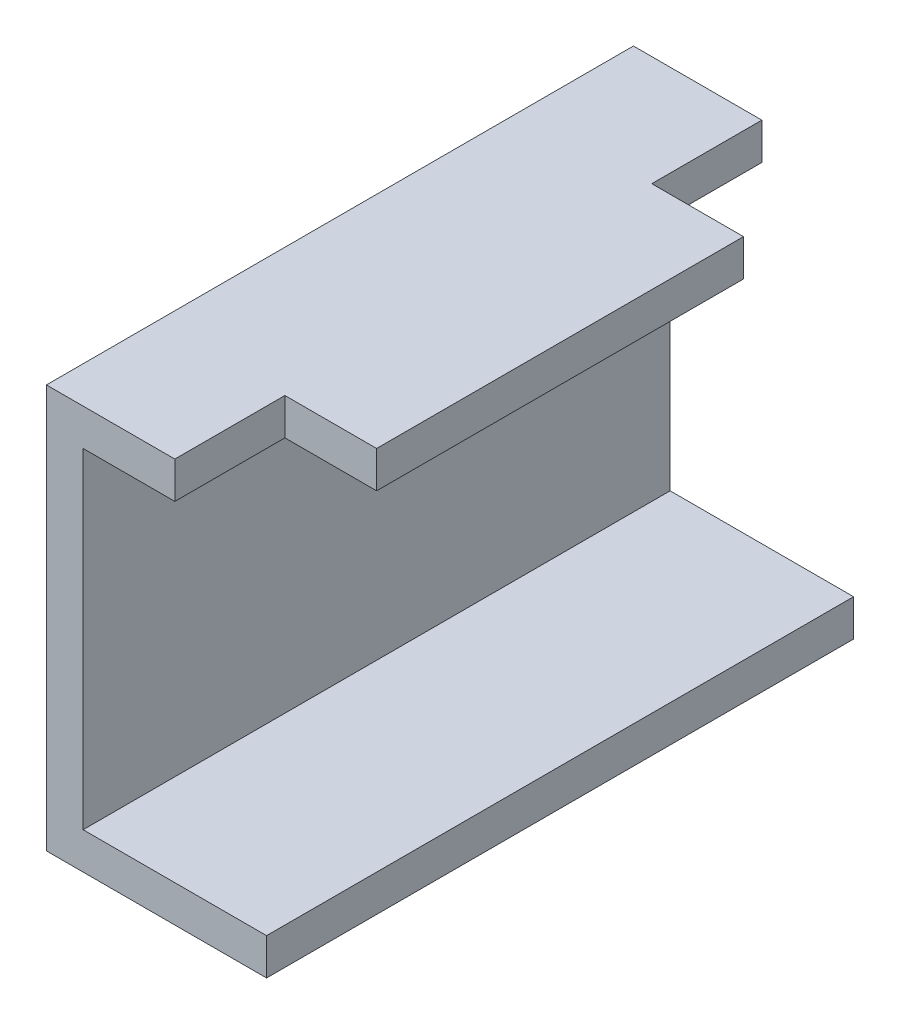
ISO-10303-21;
HEADER;
FILE_DESCRIPTION(('STEP AP214'),'2;1');
FILE_NAME('part.step','',(''),(''),'','','');
FILE_SCHEMA(('AUTOMOTIVE_DESIGN { 1 0 10303 214 1 1 1 1 }'));
ENDSEC;
DATA;
#1=APPLICATION_CONTEXT('core data for automotive mechanical design processes');
#2=APPLICATION_PROTOCOL_DEFINITION('international standard','automotive_design',2000,#1);
#3=PRODUCT_CONTEXT('',#1,'mechanical');
#4=PRODUCT('Part','Part','',(#3));
#5=PRODUCT_RELATED_PRODUCT_CATEGORY('part','',(#4));
#6=PRODUCT_DEFINITION_FORMATION('','',#4);
#7=PRODUCT_DEFINITION_CONTEXT('part definition',#1,'design');
#8=PRODUCT_DEFINITION('design','',#6,#7);
#9=PRODUCT_DEFINITION_SHAPE('','',#8);
#10=(LENGTH_UNIT() NAMED_UNIT(*) SI_UNIT(.MILLI.,.METRE.));
#11=(NAMED_UNIT(*) PLANE_ANGLE_UNIT() SI_UNIT($,.RADIAN.));
#12=(NAMED_UNIT(*) SI_UNIT($,.STERADIAN.) SOLID_ANGLE_UNIT());
#13=UNCERTAINTY_MEASURE_WITH_UNIT(LENGTH_MEASURE(1.E-05),#10,'distance_accuracy_value','');
#14=(GEOMETRIC_REPRESENTATION_CONTEXT(3) GLOBAL_UNCERTAINTY_ASSIGNED_CONTEXT((#13)) GLOBAL_UNIT_ASSIGNED_CONTEXT((#10,
#11,#12)) REPRESENTATION_CONTEXT('',''));
#15=CARTESIAN_POINT('',(0.,0.,0.));
#16=DIRECTION('',(0.,0.,1.));
#17=DIRECTION('',(1.,0.,0.));
#18=AXIS2_PLACEMENT_3D('',#15,#16,#17);
#19=CARTESIAN_POINT('',(-6.7309,3.0256,5.823));
#20=DIRECTION('',(0.,-1.,0.));
#21=DIRECTION('',(0.,0.,-1.));
#22=AXIS2_PLACEMENT_3D('',#19,#20,#21);
#23=PLANE('',#22);
#24=DIRECTION('',(0.,0.,1.));
#25=VECTOR('',#24,1.);
#26=CARTESIAN_POINT('',(-6.4809,3.0256,5.823));
#27=LINE('',#26,#25);
#28=CARTESIAN_POINT('',(-6.4809,3.0256,5.823));
#29=VERTEX_POINT('',#28);
#30=CARTESIAN_POINT('',(-6.4809,3.0256,6.623));
#31=VERTEX_POINT('',#30);
#32=EDGE_CURVE('E11',#29,#31,#27,.T.);
#33=ORIENTED_EDGE('',*,*,#32,.F.);
#34=DIRECTION('',(1.,0.,0.));
#35=VECTOR('',#34,1.);
#36=CARTESIAN_POINT('',(-6.7309,3.0256,5.823));
#37=LINE('',#36,#35);
#38=CARTESIAN_POINT('',(-6.7309,3.0256,5.823));
#39=VERTEX_POINT('',#38);
#40=EDGE_CURVE('E24',#39,#29,#37,.T.);
#41=ORIENTED_EDGE('',*,*,#40,.F.);
#42=DIRECTION('',(0.,0.,-1.));
#43=VECTOR('',#42,1.);
#44=CARTESIAN_POINT('',(-6.7309,3.0256,5.823));
#45=LINE('',#44,#43);
#46=CARTESIAN_POINT('',(-6.7309,3.0256,6.623));
#47=VERTEX_POINT('',#46);
#48=EDGE_CURVE('E203',#47,#39,#45,.T.);
#49=ORIENTED_EDGE('',*,*,#48,.F.);
#50=DIRECTION('',(1.,0.,0.));
#51=VECTOR('',#50,1.);
#52=CARTESIAN_POINT('',(-6.7309,3.0256,6.623));
#53=LINE('',#52,#51);
#54=EDGE_CURVE('E201',#47,#31,#53,.T.);
#55=ORIENTED_EDGE('',*,*,#54,.T.);
#56=EDGE_LOOP('',(#33,#41,#49,#55));
#57=FACE_BOUND('',#56,.T.);
#58=ADVANCED_FACE('F17',(#57),#23,.F.);
#59=CARTESIAN_POINT('',(-6.7809,2.9756,6.623));
#60=DIRECTION('',(0.,1.,0.));
#61=DIRECTION('',(0.,0.,1.));
#62=AXIS2_PLACEMENT_3D('',#59,#60,#61);
#63=PLANE('',#62);
#64=DIRECTION('',(0.,0.,-1.));
#65=VECTOR('',#64,1.);
#66=CARTESIAN_POINT('',(-6.4809,2.9756,6.623));
#67=LINE('',#66,#65);
#68=CARTESIAN_POINT('',(-6.4809,2.9756,6.623));
#69=VERTEX_POINT('',#68);
#70=CARTESIAN_POINT('',(-6.4809,2.9756,5.823));
#71=VERTEX_POINT('',#70);
#72=EDGE_CURVE('E199',#69,#71,#67,.T.);
#73=ORIENTED_EDGE('',*,*,#72,.F.);
#74=DIRECTION('',(1.,0.,0.));
#75=VECTOR('',#74,1.);
#76=CARTESIAN_POINT('',(-6.7809,2.9756,6.623));
#77=LINE('',#76,#75);
#78=CARTESIAN_POINT('',(-6.7809,2.9756,6.623));
#79=VERTEX_POINT('',#78);
#80=EDGE_CURVE('E196',#79,#69,#77,.T.);
#81=ORIENTED_EDGE('',*,*,#80,.F.);
#82=DIRECTION('',(0.,0.,1.));
#83=VECTOR('',#82,1.);
#84=CARTESIAN_POINT('',(-6.7809,2.9756,6.623));
#85=LINE('',#84,#83);
#86=CARTESIAN_POINT('',(-6.7809,2.9756,5.823));
#87=VERTEX_POINT('',#86);
#88=EDGE_CURVE('E193',#87,#79,#85,.T.);
#89=ORIENTED_EDGE('',*,*,#88,.F.);
#90=DIRECTION('',(1.,0.,0.));
#91=VECTOR('',#90,1.);
#92=CARTESIAN_POINT('',(-6.7809,2.9756,5.823));
#93=LINE('',#92,#91);
#94=EDGE_CURVE('E190',#87,#71,#93,.T.);
#95=ORIENTED_EDGE('',*,*,#94,.T.);
#96=EDGE_LOOP('',(#73,#81,#89,#95));
#97=FACE_BOUND('',#96,.T.);
#98=ADVANCED_FACE('F213',(#97),#63,.F.);
#99=CARTESIAN_POINT('',(-6.7309,3.4756,5.823));
#100=DIRECTION('',(1.,0.,0.));
#101=DIRECTION('',(0.,1.,0.));
#102=AXIS2_PLACEMENT_3D('',#99,#100,#101);
#103=PLANE('',#102);
#104=DIRECTION('',(0.,-1.,0.));
#105=VECTOR('',#104,1.);
#106=CARTESIAN_POINT('',(-6.7309,3.4756,6.623));
#107=LINE('',#106,#105);
#108=CARTESIAN_POINT('',(-6.7309,3.4756,6.623));
#109=VERTEX_POINT('',#108);
#110=EDGE_CURVE('E187',#109,#47,#107,.T.);
#111=ORIENTED_EDGE('',*,*,#110,.T.);
#112=ORIENTED_EDGE('',*,*,#48,.T.);
#113=DIRECTION('',(0.,-1.,0.));
#114=VECTOR('',#113,1.);
#115=CARTESIAN_POINT('',(-6.7309,3.4756,5.823));
#116=LINE('',#115,#114);
#117=CARTESIAN_POINT('',(-6.7309,3.4756,5.823));
#118=VERTEX_POINT('',#117);
#119=EDGE_CURVE('E184',#118,#39,#116,.T.);
#120=ORIENTED_EDGE('',*,*,#119,.F.);
#121=DIRECTION('',(0.,0.,1.));
#122=VECTOR('',#121,1.);
#123=CARTESIAN_POINT('',(-6.7309,3.4756,5.823));
#124=LINE('',#123,#122);
#125=EDGE_CURVE('E181',#118,#109,#124,.T.);
#126=ORIENTED_EDGE('',*,*,#125,.T.);
#127=EDGE_LOOP('',(#111,#112,#120,#126));
#128=FACE_BOUND('',#127,.T.);
#129=ADVANCED_FACE('F223',(#128),#103,.T.);
#130=CARTESIAN_POINT('',(-6.7809,3.5256,6.623));
#131=DIRECTION('',(-1.,0.,0.));
#132=DIRECTION('',(0.,-1.,0.));
#133=AXIS2_PLACEMENT_3D('',#130,#131,#132);
#134=PLANE('',#133);
#135=DIRECTION('',(0.,-1.,0.));
#136=VECTOR('',#135,1.);
#137=CARTESIAN_POINT('',(-6.7809,3.5256,5.823));
#138=LINE('',#137,#136);
#139=CARTESIAN_POINT('',(-6.7809,3.5256,5.823));
#140=VERTEX_POINT('',#139);
#141=EDGE_CURVE('E178',#140,#87,#138,.T.);
#142=ORIENTED_EDGE('',*,*,#141,.T.);
#143=ORIENTED_EDGE('',*,*,#88,.T.);
#144=DIRECTION('',(0.,-1.,0.));
#145=VECTOR('',#144,1.);
#146=CARTESIAN_POINT('',(-6.7809,3.5256,6.623));
#147=LINE('',#146,#145);
#148=CARTESIAN_POINT('',(-6.7809,3.5256,6.623));
#149=VERTEX_POINT('',#148);
#150=EDGE_CURVE('E175',#149,#79,#147,.T.);
#151=ORIENTED_EDGE('',*,*,#150,.F.);
#152=DIRECTION('',(0.,0.,-1.));
#153=VECTOR('',#152,1.);
#154=CARTESIAN_POINT('',(-6.7809,3.5256,6.623));
#155=LINE('',#154,#153);
#156=EDGE_CURVE('E172',#149,#140,#155,.T.);
#157=ORIENTED_EDGE('',*,*,#156,.T.);
#158=EDGE_LOOP('',(#142,#143,#151,#157));
#159=FACE_BOUND('',#158,.T.);
#160=ADVANCED_FACE('F215',(#159),#134,.T.);
#161=CARTESIAN_POINT('',(-7.5574609770941,3.4756,5.823));
#162=DIRECTION('',(0.,1.,0.));
#163=DIRECTION('',(-1.,0.,0.));
#164=AXIS2_PLACEMENT_3D('',#161,#162,#163);
#165=PLANE('',#164);
#166=DIRECTION('',(0.,0.,1.));
#167=VECTOR('',#166,1.);
#168=CARTESIAN_POINT('',(-6.4809,3.4756,5.823));
#169=LINE('',#168,#167);
#170=CARTESIAN_POINT('',(-6.4809,3.4756,5.973));
#171=VERTEX_POINT('',#170);
#172=CARTESIAN_POINT('',(-6.4809,3.4756,6.473));
#173=VERTEX_POINT('',#172);
#174=EDGE_CURVE('E170',#171,#173,#169,.T.);
#175=ORIENTED_EDGE('',*,*,#174,.T.);
#176=DIRECTION('',(1.,0.,0.));
#177=VECTOR('',#176,1.);
#178=CARTESIAN_POINT('',(-6.4809,3.4756,6.473));
#179=LINE('',#178,#177);
#180=CARTESIAN_POINT('',(-6.6059,3.4756,6.473));
#181=VERTEX_POINT('',#180);
#182=EDGE_CURVE('E167',#181,#173,#179,.T.);
#183=ORIENTED_EDGE('',*,*,#182,.F.);
#184=DIRECTION('',(0.,0.,-1.));
#185=VECTOR('',#184,1.);
#186=CARTESIAN_POINT('',(-6.6059,3.4756,6.623));
#187=LINE('',#186,#185);
#188=CARTESIAN_POINT('',(-6.6059,3.4756,6.623));
#189=VERTEX_POINT('',#188);
#190=EDGE_CURVE('E164',#189,#181,#187,.T.);
#191=ORIENTED_EDGE('',*,*,#190,.F.);
#192=DIRECTION('',(1.,0.,0.));
#193=VECTOR('',#192,1.);
#194=CARTESIAN_POINT('',(-7.5574609770941,3.4756,6.623));
#195=LINE('',#194,#193);
#196=EDGE_CURVE('E161',#109,#189,#195,.T.);
#197=ORIENTED_EDGE('',*,*,#196,.F.);
#198=ORIENTED_EDGE('',*,*,#125,.F.);
#199=DIRECTION('',(1.,0.,0.));
#200=VECTOR('',#199,1.);
#201=CARTESIAN_POINT('',(-7.5574609770941,3.4756,5.823));
#202=LINE('',#201,#200);
#203=CARTESIAN_POINT('',(-6.6059,3.4756,5.823));
#204=VERTEX_POINT('',#203);
#205=EDGE_CURVE('E159',#118,#204,#202,.T.);
#206=ORIENTED_EDGE('',*,*,#205,.T.);
#207=DIRECTION('',(0.,0.,-1.));
#208=VECTOR('',#207,1.);
#209=CARTESIAN_POINT('',(-6.6059,3.4756,5.823));
#210=LINE('',#209,#208);
#211=CARTESIAN_POINT('',(-6.6059,3.4756,5.973));
#212=VERTEX_POINT('',#211);
#213=EDGE_CURVE('E157',#212,#204,#210,.T.);
#214=ORIENTED_EDGE('',*,*,#213,.F.);
#215=DIRECTION('',(-1.,0.,0.));
#216=VECTOR('',#215,1.);
#217=CARTESIAN_POINT('',(-6.4809,3.4756,5.973));
#218=LINE('',#217,#216);
#219=EDGE_CURVE('E127',#171,#212,#218,.T.);
#220=ORIENTED_EDGE('',*,*,#219,.F.);
#221=EDGE_LOOP('',(#175,#183,#191,#197,#198,#206,#214,#220));
#222=FACE_BOUND('',#221,.T.);
#223=ADVANCED_FACE('F220',(#222),#165,.F.);
#224=CARTESIAN_POINT('',(-7.5574609770941,3.5256,5.823));
#225=DIRECTION('',(0.,0.,1.));
#226=DIRECTION('',(0.,-1.,0.));
#227=AXIS2_PLACEMENT_3D('',#224,#225,#226);
#228=PLANE('',#227);
#229=DIRECTION('',(1.,0.,0.));
#230=VECTOR('',#229,1.);
#231=CARTESIAN_POINT('',(-7.5574609770941,3.5256,5.823));
#232=LINE('',#231,#230);
#233=CARTESIAN_POINT('',(-6.6059,3.5256,5.823));
#234=VERTEX_POINT('',#233);
#235=EDGE_CURVE('E154',#140,#234,#232,.T.);
#236=ORIENTED_EDGE('',*,*,#235,.T.);
#237=DIRECTION('',(0.,1.,0.));
#238=VECTOR('',#237,1.);
#239=CARTESIAN_POINT('',(-6.6059,2.9746,5.823));
#240=LINE('',#239,#238);
#241=EDGE_CURVE('E121',#204,#234,#240,.T.);
#242=ORIENTED_EDGE('',*,*,#241,.F.);
#243=ORIENTED_EDGE('',*,*,#205,.F.);
#244=ORIENTED_EDGE('',*,*,#119,.T.);
#245=ORIENTED_EDGE('',*,*,#40,.T.);
#246=DIRECTION('',(0.,1.,0.));
#247=VECTOR('',#246,1.);
#248=CARTESIAN_POINT('',(-6.4809,3.2506,5.823));
#249=LINE('',#248,#247);
#250=EDGE_CURVE('E151',#71,#29,#249,.T.);
#251=ORIENTED_EDGE('',*,*,#250,.F.);
#252=ORIENTED_EDGE('',*,*,#94,.F.);
#253=ORIENTED_EDGE('',*,*,#141,.F.);
#254=EDGE_LOOP('',(#236,#242,#243,#244,#245,#251,#252,#253));
#255=FACE_BOUND('',#254,.T.);
#256=ADVANCED_FACE('F207',(#255),#228,.F.);
#257=CARTESIAN_POINT('',(-7.5574609770941,3.5256,6.623));
#258=DIRECTION('',(0.,-1.,0.));
#259=DIRECTION('',(1.,0.,0.));
#260=AXIS2_PLACEMENT_3D('',#257,#258,#259);
#261=PLANE('',#260);
#262=DIRECTION('',(0.,0.,1.));
#263=VECTOR('',#262,1.);
#264=CARTESIAN_POINT('',(-6.6059,3.5256,6.623));
#265=LINE('',#264,#263);
#266=CARTESIAN_POINT('',(-6.6059,3.5256,6.473));
#267=VERTEX_POINT('',#266);
#268=CARTESIAN_POINT('',(-6.6059,3.5256,6.623));
#269=VERTEX_POINT('',#268);
#270=EDGE_CURVE('E149',#267,#269,#265,.T.);
#271=ORIENTED_EDGE('',*,*,#270,.F.);
#272=DIRECTION('',(-1.,0.,0.));
#273=VECTOR('',#272,1.);
#274=CARTESIAN_POINT('',(-6.4809,3.5256,6.473));
#275=LINE('',#274,#273);
#276=CARTESIAN_POINT('',(-6.4809,3.5256,6.473));
#277=VERTEX_POINT('',#276);
#278=EDGE_CURVE('E146',#277,#267,#275,.T.);
#279=ORIENTED_EDGE('',*,*,#278,.F.);
#280=DIRECTION('',(0.,0.,-1.));
#281=VECTOR('',#280,1.);
#282=CARTESIAN_POINT('',(-6.4809,3.5256,6.623));
#283=LINE('',#282,#281);
#284=CARTESIAN_POINT('',(-6.4809,3.5256,5.973));
#285=VERTEX_POINT('',#284);
#286=EDGE_CURVE('E108',#277,#285,#283,.T.);
#287=ORIENTED_EDGE('',*,*,#286,.T.);
#288=DIRECTION('',(1.,0.,0.));
#289=VECTOR('',#288,1.);
#290=CARTESIAN_POINT('',(-6.4809,3.5256,5.973));
#291=LINE('',#290,#289);
#292=CARTESIAN_POINT('',(-6.6059,3.5256,5.973));
#293=VERTEX_POINT('',#292);
#294=EDGE_CURVE('E102',#293,#285,#291,.T.);
#295=ORIENTED_EDGE('',*,*,#294,.F.);
#296=DIRECTION('',(0.,0.,1.));
#297=VECTOR('',#296,1.);
#298=CARTESIAN_POINT('',(-6.6059,3.5256,5.823));
#299=LINE('',#298,#297);
#300=EDGE_CURVE('E106',#234,#293,#299,.T.);
#301=ORIENTED_EDGE('',*,*,#300,.F.);
#302=ORIENTED_EDGE('',*,*,#235,.F.);
#303=ORIENTED_EDGE('',*,*,#156,.F.);
#304=DIRECTION('',(1.,0.,0.));
#305=VECTOR('',#304,1.);
#306=CARTESIAN_POINT('',(-7.5574609770941,3.5256,6.623));
#307=LINE('',#306,#305);
#308=EDGE_CURVE('E122',#149,#269,#307,.T.);
#309=ORIENTED_EDGE('',*,*,#308,.T.);
#310=EDGE_LOOP('',(#271,#279,#287,#295,#301,#302,#303,#309));
#311=FACE_BOUND('',#310,.T.);
#312=ADVANCED_FACE('F104',(#311),#261,.F.);
#313=CARTESIAN_POINT('',(-7.5574609770941,3.4756,6.623));
#314=DIRECTION('',(0.,0.,-1.));
#315=DIRECTION('',(-1.,0.,0.));
#316=AXIS2_PLACEMENT_3D('',#313,#314,#315);
#317=PLANE('',#316);
#318=ORIENTED_EDGE('',*,*,#196,.T.);
#319=DIRECTION('',(0.,1.,0.));
#320=VECTOR('',#319,1.);
#321=CARTESIAN_POINT('',(-6.6059,2.9746,6.623));
#322=LINE('',#321,#320);
#323=EDGE_CURVE('E140',#189,#269,#322,.T.);
#324=ORIENTED_EDGE('',*,*,#323,.T.);
#325=ORIENTED_EDGE('',*,*,#308,.F.);
#326=ORIENTED_EDGE('',*,*,#150,.T.);
#327=ORIENTED_EDGE('',*,*,#80,.T.);
#328=DIRECTION('',(0.,-1.,0.));
#329=VECTOR('',#328,1.);
#330=CARTESIAN_POINT('',(-6.4809,3.2506,6.623));
#331=LINE('',#330,#329);
#332=EDGE_CURVE('E138',#31,#69,#331,.T.);
#333=ORIENTED_EDGE('',*,*,#332,.F.);
#334=ORIENTED_EDGE('',*,*,#54,.F.);
#335=ORIENTED_EDGE('',*,*,#110,.F.);
#336=EDGE_LOOP('',(#318,#324,#325,#326,#327,#333,#334,#335));
#337=FACE_BOUND('',#336,.T.);
#338=ADVANCED_FACE('F226',(#337),#317,.F.);
#339=CARTESIAN_POINT('',(-6.4809,3.5256,6.623));
#340=DIRECTION('',(-1.,0.,0.));
#341=DIRECTION('',(0.,0.,1.));
#342=AXIS2_PLACEMENT_3D('',#339,#340,#341);
#343=PLANE('',#342);
#344=ORIENTED_EDGE('',*,*,#286,.F.);
#345=DIRECTION('',(0.,1.,0.));
#346=VECTOR('',#345,1.);
#347=CARTESIAN_POINT('',(-6.4809,2.9746,6.473));
#348=LINE('',#347,#346);
#349=EDGE_CURVE('E131',#173,#277,#348,.T.);
#350=ORIENTED_EDGE('',*,*,#349,.F.);
#351=ORIENTED_EDGE('',*,*,#174,.F.);
#352=DIRECTION('',(0.,1.,0.));
#353=VECTOR('',#352,1.);
#354=CARTESIAN_POINT('',(-6.4809,2.9746,5.973));
#355=LINE('',#354,#353);
#356=EDGE_CURVE('E128',#171,#285,#355,.T.);
#357=ORIENTED_EDGE('',*,*,#356,.T.);
#358=EDGE_LOOP('',(#344,#350,#351,#357));
#359=FACE_BOUND('',#358,.T.);
#360=ADVANCED_FACE('F235',(#359),#343,.F.);
#361=CARTESIAN_POINT('',(-6.4809,3.0006,6.223));
#362=DIRECTION('',(1.,0.,0.));
#363=DIRECTION('',(0.,0.,-1.));
#364=AXIS2_PLACEMENT_3D('',#361,#362,#363);
#365=PLANE('',#364);
#366=ORIENTED_EDGE('',*,*,#332,.T.);
#367=ORIENTED_EDGE('',*,*,#72,.T.);
#368=ORIENTED_EDGE('',*,*,#250,.T.);
#369=ORIENTED_EDGE('',*,*,#32,.T.);
#370=EDGE_LOOP('',(#366,#367,#368,#369));
#371=FACE_BOUND('',#370,.T.);
#372=ADVANCED_FACE('F210',(#371),#365,.T.);
#373=CARTESIAN_POINT('',(-6.6059,2.9746,5.823));
#374=DIRECTION('',(-1.,0.,0.));
#375=DIRECTION('',(0.,-1.,0.));
#376=AXIS2_PLACEMENT_3D('',#373,#374,#375);
#377=PLANE('',#376);
#378=ORIENTED_EDGE('',*,*,#213,.T.);
#379=ORIENTED_EDGE('',*,*,#241,.T.);
#380=ORIENTED_EDGE('',*,*,#300,.T.);
#381=DIRECTION('',(0.,1.,0.));
#382=VECTOR('',#381,1.);
#383=CARTESIAN_POINT('',(-6.6059,2.9746,5.973));
#384=LINE('',#383,#382);
#385=EDGE_CURVE('E119',#212,#293,#384,.T.);
#386=ORIENTED_EDGE('',*,*,#385,.F.);
#387=EDGE_LOOP('',(#378,#379,#380,#386));
#388=FACE_BOUND('',#387,.T.);
#389=ADVANCED_FACE('F118',(#388),#377,.F.);
#390=CARTESIAN_POINT('',(-6.4809,2.9746,5.973));
#391=DIRECTION('',(0.,0.,1.));
#392=DIRECTION('',(0.,-1.,0.));
#393=AXIS2_PLACEMENT_3D('',#390,#391,#392);
#394=PLANE('',#393);
#395=ORIENTED_EDGE('',*,*,#219,.T.);
#396=ORIENTED_EDGE('',*,*,#385,.T.);
#397=ORIENTED_EDGE('',*,*,#294,.T.);
#398=ORIENTED_EDGE('',*,*,#356,.F.);
#399=EDGE_LOOP('',(#395,#396,#397,#398));
#400=FACE_BOUND('',#399,.T.);
#401=ADVANCED_FACE('F125',(#400),#394,.F.);
#402=CARTESIAN_POINT('',(-6.4809,2.9746,6.473));
#403=DIRECTION('',(0.,0.,-1.));
#404=DIRECTION('',(0.,1.,0.));
#405=AXIS2_PLACEMENT_3D('',#402,#403,#404);
#406=PLANE('',#405);
#407=ORIENTED_EDGE('',*,*,#182,.T.);
#408=ORIENTED_EDGE('',*,*,#349,.T.);
#409=ORIENTED_EDGE('',*,*,#278,.T.);
#410=DIRECTION('',(0.,1.,0.));
#411=VECTOR('',#410,1.);
#412=CARTESIAN_POINT('',(-6.6059,2.9746,6.473));
#413=LINE('',#412,#411);
#414=EDGE_CURVE('E129',#181,#267,#413,.T.);
#415=ORIENTED_EDGE('',*,*,#414,.F.);
#416=EDGE_LOOP('',(#407,#408,#409,#415));
#417=FACE_BOUND('',#416,.T.);
#418=ADVANCED_FACE('F231',(#417),#406,.F.);
#419=CARTESIAN_POINT('',(-6.6059,2.9746,6.623));
#420=DIRECTION('',(-1.,0.,0.));
#421=DIRECTION('',(0.,-1.,0.));
#422=AXIS2_PLACEMENT_3D('',#419,#420,#421);
#423=PLANE('',#422);
#424=ORIENTED_EDGE('',*,*,#190,.T.);
#425=ORIENTED_EDGE('',*,*,#414,.T.);
#426=ORIENTED_EDGE('',*,*,#270,.T.);
#427=ORIENTED_EDGE('',*,*,#323,.F.);
#428=EDGE_LOOP('',(#424,#425,#426,#427));
#429=FACE_BOUND('',#428,.T.);
#430=ADVANCED_FACE('F233',(#429),#423,.F.);
#431=CLOSED_SHELL('',(#58,#98,#129,#160,#223,#256,#312,#338,#360,#372,#389,#401,#418,#430));
#432=MANIFOLD_SOLID_BREP('B1',#431);
#433=ADVANCED_BREP_SHAPE_REPRESENTATION('',(#18,#432),#14);
#434=SHAPE_DEFINITION_REPRESENTATION(#9,#433);
ENDSEC;
END-ISO-10303-21;
